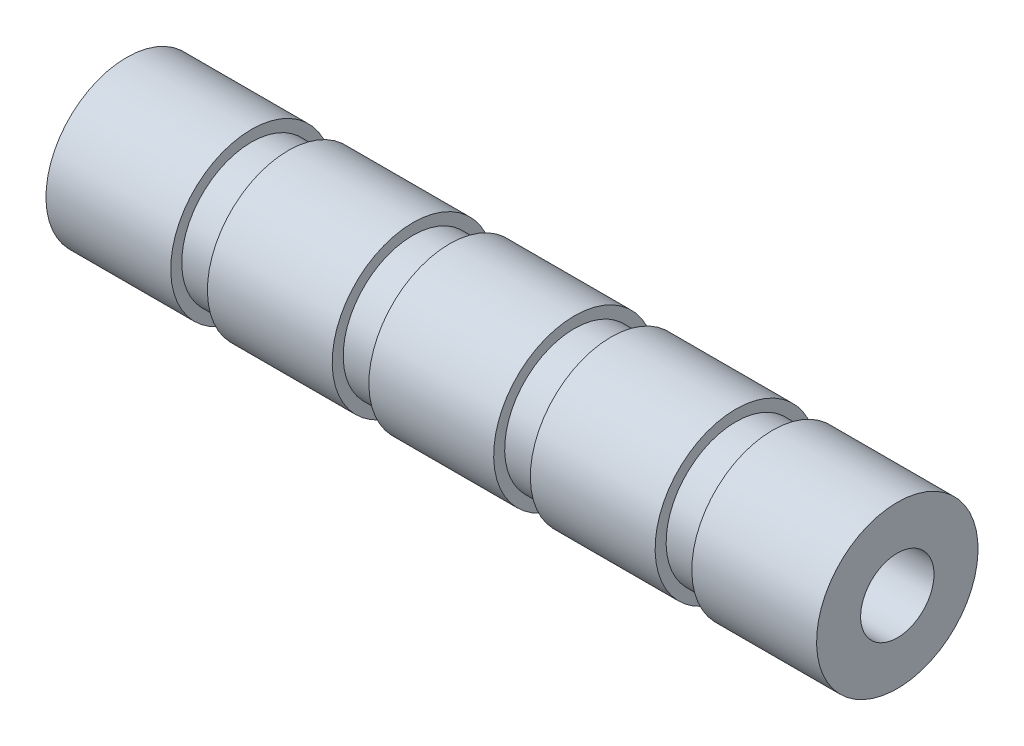
ISO-10303-21;
HEADER;
FILE_DESCRIPTION(('STEP AP214'),'2;1');
FILE_NAME('part.step','',(''),(''),'','','');
FILE_SCHEMA(('AUTOMOTIVE_DESIGN { 1 0 10303 214 1 1 1 1 }'));
ENDSEC;
DATA;
#1=APPLICATION_CONTEXT('core data for automotive mechanical design processes');
#2=APPLICATION_PROTOCOL_DEFINITION('international standard','automotive_design',2000,#1);
#3=PRODUCT_CONTEXT('',#1,'mechanical');
#4=PRODUCT('Part','Part','',(#3));
#5=PRODUCT_RELATED_PRODUCT_CATEGORY('part','',(#4));
#6=PRODUCT_DEFINITION_FORMATION('','',#4);
#7=PRODUCT_DEFINITION_CONTEXT('part definition',#1,'design');
#8=PRODUCT_DEFINITION('design','',#6,#7);
#9=PRODUCT_DEFINITION_SHAPE('','',#8);
#10=(LENGTH_UNIT() NAMED_UNIT(*) SI_UNIT(.MILLI.,.METRE.));
#11=(NAMED_UNIT(*) PLANE_ANGLE_UNIT() SI_UNIT($,.RADIAN.));
#12=(NAMED_UNIT(*) SI_UNIT($,.STERADIAN.) SOLID_ANGLE_UNIT());
#13=UNCERTAINTY_MEASURE_WITH_UNIT(LENGTH_MEASURE(1.E-05),#10,'distance_accuracy_value','');
#14=(GEOMETRIC_REPRESENTATION_CONTEXT(3) GLOBAL_UNCERTAINTY_ASSIGNED_CONTEXT((#13)) GLOBAL_UNIT_ASSIGNED_CONTEXT((#10,
#11,#12)) REPRESENTATION_CONTEXT('',''));
#15=CARTESIAN_POINT('',(0.,0.,0.));
#16=DIRECTION('',(0.,0.,1.));
#17=DIRECTION('',(1.,0.,0.));
#18=AXIS2_PLACEMENT_3D('',#15,#16,#17);
#19=CARTESIAN_POINT('',(10.9999999999999,5.50000000000001,0.));
#20=DIRECTION('',(-1.,0.,0.));
#21=DIRECTION('',(0.,-1.,0.));
#22=AXIS2_PLACEMENT_3D('',#19,#20,#21);
#23=PLANE('',#22);
#24=CARTESIAN_POINT('',(10.9999999999999,5.50000000000001,0.));
#25=DIRECTION('',(-1.,0.,0.));
#26=DIRECTION('',(0.,-1.,0.));
#27=AXIS2_PLACEMENT_3D('',#24,#25,#26);
#28=CIRCLE('',#27,5.);
#29=CARTESIAN_POINT('',(10.9999999999999,0.500000000000007,0.));
#30=VERTEX_POINT('',#29);
#31=EDGE_CURVE('E118',#30,#30,#28,.T.);
#32=ORIENTED_EDGE('',*,*,#31,.T.);
#33=EDGE_LOOP('',(#32));
#34=FACE_BOUND('',#33,.T.);
#35=CARTESIAN_POINT('',(10.9999999999999,5.50000000000001,0.));
#36=DIRECTION('',(1.,0.,0.));
#37=DIRECTION('',(0.,1.,0.));
#38=AXIS2_PLACEMENT_3D('',#35,#36,#37);
#39=CIRCLE('',#38,11.);
#40=CARTESIAN_POINT('',(10.9999999999999,16.5,0.));
#41=VERTEX_POINT('',#40);
#42=EDGE_CURVE('E114',#41,#41,#39,.T.);
#43=ORIENTED_EDGE('',*,*,#42,.T.);
#44=EDGE_LOOP('',(#43));
#45=FACE_BOUND('',#44,.T.);
#46=ADVANCED_FACE('F39',(#34,#45),#23,.F.);
#47=CARTESIAN_POINT('',(-94.,5.5,0.));
#48=DIRECTION('',(1.,0.,0.));
#49=DIRECTION('',(0.,1.,0.));
#50=AXIS2_PLACEMENT_3D('',#47,#48,#49);
#51=PLANE('',#50);
#52=CARTESIAN_POINT('',(-94.,5.5,0.));
#53=DIRECTION('',(-1.,0.,0.));
#54=DIRECTION('',(0.,-1.,0.));
#55=AXIS2_PLACEMENT_3D('',#52,#53,#54);
#56=CIRCLE('',#55,5.);
#57=CARTESIAN_POINT('',(-94.,0.499999999999994,0.));
#58=VERTEX_POINT('',#57);
#59=EDGE_CURVE('E119',#58,#58,#56,.T.);
#60=ORIENTED_EDGE('',*,*,#59,.F.);
#61=EDGE_LOOP('',(#60));
#62=FACE_BOUND('',#61,.T.);
#63=CARTESIAN_POINT('',(-94.,5.5,0.));
#64=DIRECTION('',(1.,0.,0.));
#65=DIRECTION('',(0.,1.,0.));
#66=AXIS2_PLACEMENT_3D('',#63,#64,#65);
#67=CIRCLE('',#66,11.);
#68=CARTESIAN_POINT('',(-94.,16.5,0.));
#69=VERTEX_POINT('',#68);
#70=EDGE_CURVE('E10',#69,#69,#67,.T.);
#71=ORIENTED_EDGE('',*,*,#70,.F.);
#72=EDGE_LOOP('',(#71));
#73=FACE_BOUND('',#72,.T.);
#74=ADVANCED_FACE('F136',(#62,#73),#51,.F.);
#75=CARTESIAN_POINT('',(-33.,5.5,0.));
#76=DIRECTION('',(1.,0.,0.));
#77=DIRECTION('',(0.,1.,0.));
#78=AXIS2_PLACEMENT_3D('',#75,#76,#77);
#79=CYLINDRICAL_SURFACE('',#78,11.);
#80=CARTESIAN_POINT('',(-77.,5.5,0.));
#81=DIRECTION('',(1.,0.,0.));
#82=DIRECTION('',(0.,1.,0.));
#83=AXIS2_PLACEMENT_3D('',#80,#81,#82);
#84=CIRCLE('',#83,11.);
#85=CARTESIAN_POINT('',(-77.,16.5,0.));
#86=VERTEX_POINT('',#85);
#87=EDGE_CURVE('E46',#86,#86,#84,.T.);
#88=ORIENTED_EDGE('',*,*,#87,.F.);
#89=EDGE_LOOP('',(#88));
#90=FACE_BOUND('',#89,.T.);
#91=ORIENTED_EDGE('',*,*,#70,.T.);
#92=EDGE_LOOP('',(#91));
#93=FACE_BOUND('',#92,.T.);
#94=ADVANCED_FACE('F139',(#90,#93),#79,.T.);
#95=CARTESIAN_POINT('',(-77.,-5.49999999999997,0.));
#96=DIRECTION('',(-1.,0.,0.));
#97=DIRECTION('',(0.,-1.,0.));
#98=AXIS2_PLACEMENT_3D('',#95,#96,#97);
#99=PLANE('',#98);
#100=CARTESIAN_POINT('',(-77.,5.5,0.));
#101=DIRECTION('',(1.,0.,0.));
#102=DIRECTION('',(0.,1.,0.));
#103=AXIS2_PLACEMENT_3D('',#100,#101,#102);
#104=CIRCLE('',#103,9.49999999999993);
#105=CARTESIAN_POINT('',(-77.,14.9999999999999,0.));
#106=VERTEX_POINT('',#105);
#107=EDGE_CURVE('E51',#106,#106,#104,.T.);
#108=ORIENTED_EDGE('',*,*,#107,.F.);
#109=EDGE_LOOP('',(#108));
#110=FACE_BOUND('',#109,.T.);
#111=ORIENTED_EDGE('',*,*,#87,.T.);
#112=EDGE_LOOP('',(#111));
#113=FACE_BOUND('',#112,.T.);
#114=ADVANCED_FACE('F144',(#110,#113),#99,.F.);
#115=CARTESIAN_POINT('',(-33.,5.5,0.));
#116=DIRECTION('',(1.,0.,0.));
#117=DIRECTION('',(0.,1.,0.));
#118=AXIS2_PLACEMENT_3D('',#115,#116,#117);
#119=CYLINDRICAL_SURFACE('',#118,9.49999999999993);
#120=CARTESIAN_POINT('',(-72.,5.5,0.));
#121=DIRECTION('',(1.,0.,0.));
#122=DIRECTION('',(0.,1.,0.));
#123=AXIS2_PLACEMENT_3D('',#120,#121,#122);
#124=CIRCLE('',#123,9.49999999999993);
#125=CARTESIAN_POINT('',(-72.,14.9999999999999,0.));
#126=VERTEX_POINT('',#125);
#127=EDGE_CURVE('E56',#126,#126,#124,.T.);
#128=ORIENTED_EDGE('',*,*,#127,.F.);
#129=EDGE_LOOP('',(#128));
#130=FACE_BOUND('',#129,.T.);
#131=ORIENTED_EDGE('',*,*,#107,.T.);
#132=EDGE_LOOP('',(#131));
#133=FACE_BOUND('',#132,.T.);
#134=ADVANCED_FACE('F150',(#130,#133),#119,.T.);
#135=CARTESIAN_POINT('',(-72.,-3.99999999999993,0.));
#136=DIRECTION('',(1.,0.,0.));
#137=DIRECTION('',(0.,1.,0.));
#138=AXIS2_PLACEMENT_3D('',#135,#136,#137);
#139=PLANE('',#138);
#140=CARTESIAN_POINT('',(-72.,5.5,0.));
#141=DIRECTION('',(1.,0.,0.));
#142=DIRECTION('',(0.,1.,0.));
#143=AXIS2_PLACEMENT_3D('',#140,#141,#142);
#144=CIRCLE('',#143,11.);
#145=CARTESIAN_POINT('',(-72.,16.5,0.));
#146=VERTEX_POINT('',#145);
#147=EDGE_CURVE('E62',#146,#146,#144,.T.);
#148=ORIENTED_EDGE('',*,*,#147,.F.);
#149=EDGE_LOOP('',(#148));
#150=FACE_BOUND('',#149,.T.);
#151=ORIENTED_EDGE('',*,*,#127,.T.);
#152=EDGE_LOOP('',(#151));
#153=FACE_BOUND('',#152,.T.);
#154=ADVANCED_FACE('F154',(#150,#153),#139,.F.);
#155=CARTESIAN_POINT('',(-33.,5.5,0.));
#156=DIRECTION('',(1.,0.,0.));
#157=DIRECTION('',(0.,1.,0.));
#158=AXIS2_PLACEMENT_3D('',#155,#156,#157);
#159=CYLINDRICAL_SURFACE('',#158,11.);
#160=CARTESIAN_POINT('',(-55.,5.5,0.));
#161=DIRECTION('',(1.,0.,0.));
#162=DIRECTION('',(0.,1.,0.));
#163=AXIS2_PLACEMENT_3D('',#160,#161,#162);
#164=CIRCLE('',#163,11.);
#165=CARTESIAN_POINT('',(-55.,16.5,0.));
#166=VERTEX_POINT('',#165);
#167=EDGE_CURVE('E66',#166,#166,#164,.T.);
#168=ORIENTED_EDGE('',*,*,#167,.F.);
#169=EDGE_LOOP('',(#168));
#170=FACE_BOUND('',#169,.T.);
#171=ORIENTED_EDGE('',*,*,#147,.T.);
#172=EDGE_LOOP('',(#171));
#173=FACE_BOUND('',#172,.T.);
#174=ADVANCED_FACE('F158',(#170,#173),#159,.T.);
#175=CARTESIAN_POINT('',(-55.,-5.49999999999997,0.));
#176=DIRECTION('',(-1.,0.,0.));
#177=DIRECTION('',(0.,-1.,0.));
#178=AXIS2_PLACEMENT_3D('',#175,#176,#177);
#179=PLANE('',#178);
#180=CARTESIAN_POINT('',(-55.,5.5,0.));
#181=DIRECTION('',(1.,0.,0.));
#182=DIRECTION('',(0.,1.,0.));
#183=AXIS2_PLACEMENT_3D('',#180,#181,#182);
#184=CIRCLE('',#183,9.49999999999993);
#185=CARTESIAN_POINT('',(-55.,14.9999999999999,0.));
#186=VERTEX_POINT('',#185);
#187=EDGE_CURVE('E70',#186,#186,#184,.T.);
#188=ORIENTED_EDGE('',*,*,#187,.F.);
#189=EDGE_LOOP('',(#188));
#190=FACE_BOUND('',#189,.T.);
#191=ORIENTED_EDGE('',*,*,#167,.T.);
#192=EDGE_LOOP('',(#191));
#193=FACE_BOUND('',#192,.T.);
#194=ADVANCED_FACE('F162',(#190,#193),#179,.F.);
#195=CARTESIAN_POINT('',(-33.,5.5,0.));
#196=DIRECTION('',(1.,0.,0.));
#197=DIRECTION('',(0.,1.,0.));
#198=AXIS2_PLACEMENT_3D('',#195,#196,#197);
#199=CYLINDRICAL_SURFACE('',#198,9.49999999999993);
#200=CARTESIAN_POINT('',(-50.,5.5,0.));
#201=DIRECTION('',(1.,0.,0.));
#202=DIRECTION('',(0.,1.,0.));
#203=AXIS2_PLACEMENT_3D('',#200,#201,#202);
#204=CIRCLE('',#203,9.49999999999993);
#205=CARTESIAN_POINT('',(-50.,14.9999999999999,0.));
#206=VERTEX_POINT('',#205);
#207=EDGE_CURVE('E74',#206,#206,#204,.T.);
#208=ORIENTED_EDGE('',*,*,#207,.F.);
#209=EDGE_LOOP('',(#208));
#210=FACE_BOUND('',#209,.T.);
#211=ORIENTED_EDGE('',*,*,#187,.T.);
#212=EDGE_LOOP('',(#211));
#213=FACE_BOUND('',#212,.T.);
#214=ADVANCED_FACE('F166',(#210,#213),#199,.T.);
#215=CARTESIAN_POINT('',(-50.,-3.99999999999993,0.));
#216=DIRECTION('',(1.,0.,0.));
#217=DIRECTION('',(0.,1.,0.));
#218=AXIS2_PLACEMENT_3D('',#215,#216,#217);
#219=PLANE('',#218);
#220=CARTESIAN_POINT('',(-50.,5.5,0.));
#221=DIRECTION('',(1.,0.,0.));
#222=DIRECTION('',(0.,1.,0.));
#223=AXIS2_PLACEMENT_3D('',#220,#221,#222);
#224=CIRCLE('',#223,11.);
#225=CARTESIAN_POINT('',(-50.,16.5,0.));
#226=VERTEX_POINT('',#225);
#227=EDGE_CURVE('E78',#226,#226,#224,.T.);
#228=ORIENTED_EDGE('',*,*,#227,.F.);
#229=EDGE_LOOP('',(#228));
#230=FACE_BOUND('',#229,.T.);
#231=ORIENTED_EDGE('',*,*,#207,.T.);
#232=EDGE_LOOP('',(#231));
#233=FACE_BOUND('',#232,.T.);
#234=ADVANCED_FACE('F170',(#230,#233),#219,.F.);
#235=CARTESIAN_POINT('',(-33.,5.5,0.));
#236=DIRECTION('',(1.,0.,0.));
#237=DIRECTION('',(0.,1.,0.));
#238=AXIS2_PLACEMENT_3D('',#235,#236,#237);
#239=CYLINDRICAL_SURFACE('',#238,11.);
#240=CARTESIAN_POINT('',(-33.,5.5,0.));
#241=DIRECTION('',(1.,0.,0.));
#242=DIRECTION('',(0.,1.,0.));
#243=AXIS2_PLACEMENT_3D('',#240,#241,#242);
#244=CIRCLE('',#243,11.);
#245=CARTESIAN_POINT('',(-33.,16.5,0.));
#246=VERTEX_POINT('',#245);
#247=EDGE_CURVE('E82',#246,#246,#244,.T.);
#248=ORIENTED_EDGE('',*,*,#247,.F.);
#249=EDGE_LOOP('',(#248));
#250=FACE_BOUND('',#249,.T.);
#251=ORIENTED_EDGE('',*,*,#227,.T.);
#252=EDGE_LOOP('',(#251));
#253=FACE_BOUND('',#252,.T.);
#254=ADVANCED_FACE('F174',(#250,#253),#239,.T.);
#255=CARTESIAN_POINT('',(-33.,-5.49999999999997,0.));
#256=DIRECTION('',(-1.,0.,0.));
#257=DIRECTION('',(0.,-1.,0.));
#258=AXIS2_PLACEMENT_3D('',#255,#256,#257);
#259=PLANE('',#258);
#260=CARTESIAN_POINT('',(-33.,5.5,0.));
#261=DIRECTION('',(1.,0.,0.));
#262=DIRECTION('',(0.,1.,0.));
#263=AXIS2_PLACEMENT_3D('',#260,#261,#262);
#264=CIRCLE('',#263,9.49999999999994);
#265=CARTESIAN_POINT('',(-33.,14.9999999999999,0.));
#266=VERTEX_POINT('',#265);
#267=EDGE_CURVE('E86',#266,#266,#264,.T.);
#268=ORIENTED_EDGE('',*,*,#267,.F.);
#269=EDGE_LOOP('',(#268));
#270=FACE_BOUND('',#269,.T.);
#271=ORIENTED_EDGE('',*,*,#247,.T.);
#272=EDGE_LOOP('',(#271));
#273=FACE_BOUND('',#272,.T.);
#274=ADVANCED_FACE('F178',(#270,#273),#259,.F.);
#275=CARTESIAN_POINT('',(-33.,5.5,0.));
#276=DIRECTION('',(1.,0.,0.));
#277=DIRECTION('',(0.,1.,0.));
#278=AXIS2_PLACEMENT_3D('',#275,#276,#277);
#279=CYLINDRICAL_SURFACE('',#278,9.49999999999994);
#280=CARTESIAN_POINT('',(-28.,5.5,0.));
#281=DIRECTION('',(1.,0.,0.));
#282=DIRECTION('',(0.,1.,0.));
#283=AXIS2_PLACEMENT_3D('',#280,#281,#282);
#284=CIRCLE('',#283,9.49999999999994);
#285=CARTESIAN_POINT('',(-28.,14.9999999999999,0.));
#286=VERTEX_POINT('',#285);
#287=EDGE_CURVE('E90',#286,#286,#284,.T.);
#288=ORIENTED_EDGE('',*,*,#287,.F.);
#289=EDGE_LOOP('',(#288));
#290=FACE_BOUND('',#289,.T.);
#291=ORIENTED_EDGE('',*,*,#267,.T.);
#292=EDGE_LOOP('',(#291));
#293=FACE_BOUND('',#292,.T.);
#294=ADVANCED_FACE('F182',(#290,#293),#279,.T.);
#295=CARTESIAN_POINT('',(-28.,-3.99999999999993,0.));
#296=DIRECTION('',(1.,0.,0.));
#297=DIRECTION('',(0.,1.,0.));
#298=AXIS2_PLACEMENT_3D('',#295,#296,#297);
#299=PLANE('',#298);
#300=CARTESIAN_POINT('',(-28.,5.5,0.));
#301=DIRECTION('',(1.,0.,0.));
#302=DIRECTION('',(0.,1.,0.));
#303=AXIS2_PLACEMENT_3D('',#300,#301,#302);
#304=CIRCLE('',#303,11.);
#305=CARTESIAN_POINT('',(-28.,16.5,0.));
#306=VERTEX_POINT('',#305);
#307=EDGE_CURVE('E94',#306,#306,#304,.T.);
#308=ORIENTED_EDGE('',*,*,#307,.F.);
#309=EDGE_LOOP('',(#308));
#310=FACE_BOUND('',#309,.T.);
#311=ORIENTED_EDGE('',*,*,#287,.T.);
#312=EDGE_LOOP('',(#311));
#313=FACE_BOUND('',#312,.T.);
#314=ADVANCED_FACE('F186',(#310,#313),#299,.F.);
#315=CARTESIAN_POINT('',(-33.,5.5,0.));
#316=DIRECTION('',(1.,0.,0.));
#317=DIRECTION('',(0.,1.,0.));
#318=AXIS2_PLACEMENT_3D('',#315,#316,#317);
#319=CYLINDRICAL_SURFACE('',#318,11.);
#320=CARTESIAN_POINT('',(-11.0000000000001,5.50000000000001,0.));
#321=DIRECTION('',(1.,0.,0.));
#322=DIRECTION('',(0.,1.,0.));
#323=AXIS2_PLACEMENT_3D('',#320,#321,#322);
#324=CIRCLE('',#323,11.);
#325=CARTESIAN_POINT('',(-11.0000000000001,16.5,0.));
#326=VERTEX_POINT('',#325);
#327=EDGE_CURVE('E98',#326,#326,#324,.T.);
#328=ORIENTED_EDGE('',*,*,#327,.F.);
#329=EDGE_LOOP('',(#328));
#330=FACE_BOUND('',#329,.T.);
#331=ORIENTED_EDGE('',*,*,#307,.T.);
#332=EDGE_LOOP('',(#331));
#333=FACE_BOUND('',#332,.T.);
#334=ADVANCED_FACE('F190',(#330,#333),#319,.T.);
#335=CARTESIAN_POINT('',(-11.0000000000001,-5.49999999999997,0.));
#336=DIRECTION('',(-1.,0.,0.));
#337=DIRECTION('',(0.,-1.,0.));
#338=AXIS2_PLACEMENT_3D('',#335,#336,#337);
#339=PLANE('',#338);
#340=CARTESIAN_POINT('',(-11.0000000000001,5.50000000000001,0.));
#341=DIRECTION('',(1.,0.,0.));
#342=DIRECTION('',(0.,1.,0.));
#343=AXIS2_PLACEMENT_3D('',#340,#341,#342);
#344=CIRCLE('',#343,9.49999999999994);
#345=CARTESIAN_POINT('',(-11.0000000000001,14.9999999999999,0.));
#346=VERTEX_POINT('',#345);
#347=EDGE_CURVE('E102',#346,#346,#344,.T.);
#348=ORIENTED_EDGE('',*,*,#347,.F.);
#349=EDGE_LOOP('',(#348));
#350=FACE_BOUND('',#349,.T.);
#351=ORIENTED_EDGE('',*,*,#327,.T.);
#352=EDGE_LOOP('',(#351));
#353=FACE_BOUND('',#352,.T.);
#354=ADVANCED_FACE('F194',(#350,#353),#339,.F.);
#355=CARTESIAN_POINT('',(-33.,5.5,0.));
#356=DIRECTION('',(1.,0.,0.));
#357=DIRECTION('',(0.,1.,0.));
#358=AXIS2_PLACEMENT_3D('',#355,#356,#357);
#359=CYLINDRICAL_SURFACE('',#358,9.49999999999994);
#360=CARTESIAN_POINT('',(-6.00000000000007,5.50000000000001,0.));
#361=DIRECTION('',(1.,0.,0.));
#362=DIRECTION('',(0.,1.,0.));
#363=AXIS2_PLACEMENT_3D('',#360,#361,#362);
#364=CIRCLE('',#363,9.49999999999994);
#365=CARTESIAN_POINT('',(-6.00000000000007,14.9999999999999,0.));
#366=VERTEX_POINT('',#365);
#367=EDGE_CURVE('E106',#366,#366,#364,.T.);
#368=ORIENTED_EDGE('',*,*,#367,.F.);
#369=EDGE_LOOP('',(#368));
#370=FACE_BOUND('',#369,.T.);
#371=ORIENTED_EDGE('',*,*,#347,.T.);
#372=EDGE_LOOP('',(#371));
#373=FACE_BOUND('',#372,.T.);
#374=ADVANCED_FACE('F198',(#370,#373),#359,.T.);
#375=CARTESIAN_POINT('',(-6.00000000000007,-5.49999999999997,0.));
#376=DIRECTION('',(1.,0.,0.));
#377=DIRECTION('',(0.,1.,0.));
#378=AXIS2_PLACEMENT_3D('',#375,#376,#377);
#379=PLANE('',#378);
#380=CARTESIAN_POINT('',(-6.00000000000007,5.50000000000001,0.));
#381=DIRECTION('',(1.,0.,0.));
#382=DIRECTION('',(0.,1.,0.));
#383=AXIS2_PLACEMENT_3D('',#380,#381,#382);
#384=CIRCLE('',#383,11.);
#385=CARTESIAN_POINT('',(-6.00000000000007,16.5,0.));
#386=VERTEX_POINT('',#385);
#387=EDGE_CURVE('E110',#386,#386,#384,.T.);
#388=ORIENTED_EDGE('',*,*,#387,.F.);
#389=EDGE_LOOP('',(#388));
#390=FACE_BOUND('',#389,.T.);
#391=ORIENTED_EDGE('',*,*,#367,.T.);
#392=EDGE_LOOP('',(#391));
#393=FACE_BOUND('',#392,.T.);
#394=ADVANCED_FACE('F202',(#390,#393),#379,.F.);
#395=CARTESIAN_POINT('',(-33.,5.5,0.));
#396=DIRECTION('',(1.,0.,0.));
#397=DIRECTION('',(0.,1.,0.));
#398=AXIS2_PLACEMENT_3D('',#395,#396,#397);
#399=CYLINDRICAL_SURFACE('',#398,11.);
#400=ORIENTED_EDGE('',*,*,#42,.F.);
#401=EDGE_LOOP('',(#400));
#402=FACE_BOUND('',#401,.T.);
#403=ORIENTED_EDGE('',*,*,#387,.T.);
#404=EDGE_LOOP('',(#403));
#405=FACE_BOUND('',#404,.T.);
#406=ADVANCED_FACE('F132',(#402,#405),#399,.T.);
#407=CARTESIAN_POINT('',(10.9999999999999,5.50000000000001,0.));
#408=DIRECTION('',(-1.,0.,0.));
#409=DIRECTION('',(0.,-1.,0.));
#410=AXIS2_PLACEMENT_3D('',#407,#408,#409);
#411=CYLINDRICAL_SURFACE('',#410,5.);
#412=CARTESIAN_POINT('',(10.9999999999999,0.500000000000007,0.));
#413=CARTESIAN_POINT('',(9.90624999999991,0.500000000000006,0.));
#414=CARTESIAN_POINT('',(8.81249999999991,0.500000000000006,0.));
#415=CARTESIAN_POINT('',(6.62499999999992,0.500000000000006,0.));
#416=CARTESIAN_POINT('',(5.53124999999992,0.500000000000006,0.));
#417=CARTESIAN_POINT('',(3.34374999999992,0.500000000000006,0.));
#418=CARTESIAN_POINT('',(2.24999999999992,0.500000000000005,0.));
#419=CARTESIAN_POINT('',(0.0624999999999213,0.500000000000005,0.));
#420=CARTESIAN_POINT('',(-1.03125000000008,0.500000000000005,0.));
#421=CARTESIAN_POINT('',(-3.21875000000008,0.500000000000005,0.));
#422=CARTESIAN_POINT('',(-4.31250000000008,0.500000000000005,0.));
#423=CARTESIAN_POINT('',(-6.50000000000008,0.500000000000004,0.));
#424=CARTESIAN_POINT('',(-7.59375000000008,0.500000000000004,0.));
#425=CARTESIAN_POINT('',(-9.78125000000007,0.500000000000004,0.));
#426=CARTESIAN_POINT('',(-10.8750000000001,0.500000000000004,0.));
#427=CARTESIAN_POINT('',(-13.0625000000001,0.500000000000004,0.));
#428=CARTESIAN_POINT('',(-14.1562500000001,0.500000000000003,0.));
#429=CARTESIAN_POINT('',(-16.3437500000001,0.500000000000003,0.));
#430=CARTESIAN_POINT('',(-17.4375000000001,0.500000000000003,0.));
#431=CARTESIAN_POINT('',(-19.6250000000001,0.500000000000003,0.));
#432=CARTESIAN_POINT('',(-20.7187500000001,0.500000000000003,0.));
#433=CARTESIAN_POINT('',(-22.9062500000001,0.500000000000003,0.));
#434=CARTESIAN_POINT('',(-24.0000000000001,0.500000000000002,0.));
#435=CARTESIAN_POINT('',(-26.1875000000001,0.500000000000002,0.));
#436=CARTESIAN_POINT('',(-27.2812500000001,0.500000000000002,0.));
#437=CARTESIAN_POINT('',(-29.4687500000001,0.500000000000002,0.));
#438=CARTESIAN_POINT('',(-30.5625000000001,0.500000000000002,0.));
#439=CARTESIAN_POINT('',(-32.7500000000001,0.500000000000001,0.));
#440=CARTESIAN_POINT('',(-33.8437500000001,0.500000000000001,0.));
#441=CARTESIAN_POINT('',(-36.0312500000001,0.500000000000001,0.));
#442=CARTESIAN_POINT('',(-37.1250000000001,0.500000000000001,0.));
#443=CARTESIAN_POINT('',(-39.3125000000001,0.500000000000001,0.));
#444=CARTESIAN_POINT('',(-40.4062500000001,0.5,0.));
#445=CARTESIAN_POINT('',(-42.5937500000001,0.5,0.));
#446=CARTESIAN_POINT('',(-43.6875000000001,0.5,0.));
#447=CARTESIAN_POINT('',(-45.8750000000001,0.5,0.));
#448=CARTESIAN_POINT('',(-46.9687500000001,0.5,0.));
#449=CARTESIAN_POINT('',(-49.1562500000001,0.499999999999999,0.));
#450=CARTESIAN_POINT('',(-50.2500000000001,0.499999999999999,0.));
#451=CARTESIAN_POINT('',(-52.4375000000001,0.499999999999999,0.));
#452=CARTESIAN_POINT('',(-53.53125,0.499999999999999,0.));
#453=CARTESIAN_POINT('',(-55.71875,0.499999999999999,0.));
#454=CARTESIAN_POINT('',(-56.8125,0.499999999999999,0.));
#455=CARTESIAN_POINT('',(-59.,0.499999999999998,0.));
#456=CARTESIAN_POINT('',(-60.09375,0.499999999999998,0.));
#457=CARTESIAN_POINT('',(-62.28125,0.499999999999998,0.));
#458=CARTESIAN_POINT('',(-63.375,0.499999999999998,0.));
#459=CARTESIAN_POINT('',(-65.5625,0.499999999999998,0.));
#460=CARTESIAN_POINT('',(-66.65625,0.499999999999997,0.));
#461=CARTESIAN_POINT('',(-68.84375,0.499999999999997,0.));
#462=CARTESIAN_POINT('',(-69.9375,0.499999999999997,0.));
#463=CARTESIAN_POINT('',(-72.125,0.499999999999997,0.));
#464=CARTESIAN_POINT('',(-73.21875,0.499999999999997,0.));
#465=CARTESIAN_POINT('',(-75.40625,0.499999999999996,0.));
#466=CARTESIAN_POINT('',(-76.5,0.499999999999996,0.));
#467=CARTESIAN_POINT('',(-78.6875,0.499999999999996,0.));
#468=CARTESIAN_POINT('',(-79.78125,0.499999999999996,0.));
#469=CARTESIAN_POINT('',(-81.96875,0.499999999999996,0.));
#470=CARTESIAN_POINT('',(-83.0625,0.499999999999995,0.));
#471=CARTESIAN_POINT('',(-85.25,0.499999999999995,0.));
#472=CARTESIAN_POINT('',(-86.34375,0.499999999999995,0.));
#473=CARTESIAN_POINT('',(-88.53125,0.499999999999995,0.));
#474=CARTESIAN_POINT('',(-89.625,0.499999999999995,0.));
#475=CARTESIAN_POINT('',(-91.8125,0.499999999999994,0.));
#476=CARTESIAN_POINT('',(-92.90625,0.499999999999994,0.));
#477=CARTESIAN_POINT('',(-94.,0.499999999999994,0.));
#478=B_SPLINE_CURVE_WITH_KNOTS('',3,(#412,#413,#414,#415,#416,#417,#418,#419,#420,#421,#422,
#423,#424,#425,#426,#427,#428,#429,#430,#431,#432,#433,#434,#435,#436,#437,#438,#439,#440,#441,
#442,#443,#444,#445,#446,#447,#448,#449,#450,#451,#452,#453,#454,#455,#456,#457,#458,#459,#460,
#461,#462,#463,#464,#465,#466,#467,#468,#469,#470,#471,#472,#473,#474,#475,#476,#477),
.UNSPECIFIED.,.F.,.F.,(4,2,2,2,2,2,2,2,2,2,2,2,2,2,2,2,2,2,2,2,2,2,2,2,2,2,2,2,2,2,2,2,4),(0.,
3.28125,6.5625,9.84374999999999,13.125,16.40625,19.6875,22.96875,26.25,29.53125,32.8125,
36.09375,39.375,42.65625,45.9375,49.21875,52.5,55.78125,59.0625,62.34375,65.625,68.90625,
72.1875,75.46875,78.7499999999999,82.0312499999999,85.3124999999999,88.5937499999999,
91.8749999999999,95.1562499999999,98.4374999999999,101.71875,105.),.UNSPECIFIED.);
#479=EDGE_CURVE('BSEAM129',#30,#58,#478,.T.);
#480=ORIENTED_EDGE('',*,*,#31,.F.);
#481=ORIENTED_EDGE('',*,*,#59,.T.);
#482=ORIENTED_EDGE('',*,*,#479,.T.);
#483=ORIENTED_EDGE('',*,*,#479,.F.);
#484=EDGE_LOOP('',(#480,#482,#481,#483));
#485=FACE_BOUND('',#484,.T.);
#486=ADVANCED_FACE('F129',(#485),#411,.F.);
#487=CLOSED_SHELL('',(#46,#74,#94,#114,#134,#154,#174,#194,#214,#234,#254,#274,#294,#314,#334,
#354,#374,#394,#406,#486));
#488=MANIFOLD_SOLID_BREP('B2',#487);
#489=ADVANCED_BREP_SHAPE_REPRESENTATION('',(#18,#488),#14);
#490=SHAPE_DEFINITION_REPRESENTATION(#9,#489);
ENDSEC;
END-ISO-10303-21;
